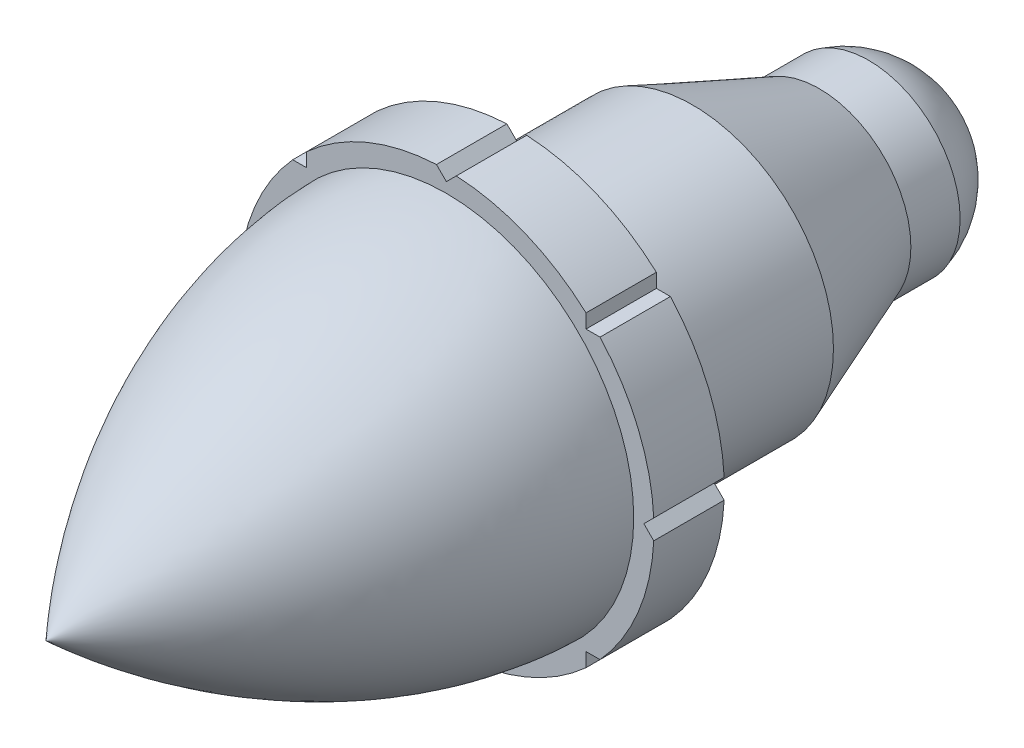
ISO-10303-21;
HEADER;
FILE_DESCRIPTION(('STEP AP214'),'2;1');
FILE_NAME('part.step','',(''),(''),'','','');
FILE_SCHEMA(('AUTOMOTIVE_DESIGN { 1 0 10303 214 1 1 1 1 }'));
ENDSEC;
DATA;
#1=APPLICATION_CONTEXT('core data for automotive mechanical design processes');
#2=APPLICATION_PROTOCOL_DEFINITION('international standard','automotive_design',2000,#1);
#3=PRODUCT_CONTEXT('',#1,'mechanical');
#4=PRODUCT('Part','Part','',(#3));
#5=PRODUCT_RELATED_PRODUCT_CATEGORY('part','',(#4));
#6=PRODUCT_DEFINITION_FORMATION('','',#4);
#7=PRODUCT_DEFINITION_CONTEXT('part definition',#1,'design');
#8=PRODUCT_DEFINITION('design','',#6,#7);
#9=PRODUCT_DEFINITION_SHAPE('','',#8);
#10=(LENGTH_UNIT() NAMED_UNIT(*) SI_UNIT(.MILLI.,.METRE.));
#11=(NAMED_UNIT(*) PLANE_ANGLE_UNIT() SI_UNIT($,.RADIAN.));
#12=(NAMED_UNIT(*) SI_UNIT($,.STERADIAN.) SOLID_ANGLE_UNIT());
#13=UNCERTAINTY_MEASURE_WITH_UNIT(LENGTH_MEASURE(1.E-05),#10,'distance_accuracy_value','');
#14=(GEOMETRIC_REPRESENTATION_CONTEXT(3) GLOBAL_UNCERTAINTY_ASSIGNED_CONTEXT((#13)) GLOBAL_UNIT_ASSIGNED_CONTEXT((#10,
#11,#12)) REPRESENTATION_CONTEXT('',''));
#15=CARTESIAN_POINT('',(0.,0.,0.));
#16=DIRECTION('',(0.,0.,1.));
#17=DIRECTION('',(1.,0.,0.));
#18=AXIS2_PLACEMENT_3D('',#15,#16,#17);
#19=CARTESIAN_POINT('',(0.,0.,20.0206031837859));
#20=DIRECTION('',(0.,0.,1.));
#21=DIRECTION('',(1.,0.,0.));
#22=AXIS2_PLACEMENT_3D('',#19,#20,#21);
#23=CYLINDRICAL_SURFACE('',#22,7.493);
#24=CARTESIAN_POINT('',(0.,0.,7.32584661558963));
#25=DIRECTION('',(0.,0.,1.));
#26=DIRECTION('',(1.,0.,0.));
#27=AXIS2_PLACEMENT_3D('',#24,#25,#26);
#28=CIRCLE('',#27,7.493);
#29=CARTESIAN_POINT('',(-7.48448393377129,-0.357140371730017,7.32584661558963));
#30=VERTEX_POINT('',#29);
#31=CARTESIAN_POINT('',(-5.54486572193718,-5.03979296456571,7.32584661558963));
#32=VERTEX_POINT('',#31);
#33=EDGE_CURVE('E405',#30,#32,#28,.T.);
#34=ORIENTED_EDGE('',*,*,#33,.F.);
#35=DIRECTION('',(0.,0.,1.));
#36=VECTOR('',#35,1.);
#37=CARTESIAN_POINT('',(-7.48448393377129,-0.357140371730017,-10.4541533844104));
#38=LINE('',#37,#36);
#39=CARTESIAN_POINT('',(-7.48448393377129,-0.357140371730017,4.78584661558963));
#40=VERTEX_POINT('',#39);
#41=EDGE_CURVE('E259',#40,#30,#38,.T.);
#42=ORIENTED_EDGE('',*,*,#41,.F.);
#43=CARTESIAN_POINT('',(0.,0.,4.78584661558963));
#44=DIRECTION('',(0.,0.,1.));
#45=DIRECTION('',(1.,0.,0.));
#46=AXIS2_PLACEMENT_3D('',#43,#44,#45);
#47=CIRCLE('',#46,7.493);
#48=CARTESIAN_POINT('',(-5.54486572193718,-5.03979296456571,4.78584661558963));
#49=VERTEX_POINT('',#48);
#50=EDGE_CURVE('E452',#40,#49,#47,.T.);
#51=ORIENTED_EDGE('',*,*,#50,.T.);
#52=DIRECTION('',(0.,0.,1.));
#53=VECTOR('',#52,1.);
#54=CARTESIAN_POINT('',(-5.54486572193718,-5.03979296456571,-10.4541533844104));
#55=LINE('',#54,#53);
#56=EDGE_CURVE('E273',#49,#32,#55,.T.);
#57=ORIENTED_EDGE('',*,*,#56,.T.);
#58=EDGE_LOOP('',(#34,#42,#51,#57));
#59=FACE_BOUND('',#58,.T.);
#60=ADVANCED_FACE('F38',(#59),#23,.T.);
#61=CARTESIAN_POINT('',(-5.03979296456566,-5.54486572193723,7.32584661558963));
#62=VERTEX_POINT('',#61);
#63=CARTESIAN_POINT('',(-0.35714037172999,-7.48448393377129,7.32584661558963));
#64=VERTEX_POINT('',#63);
#65=EDGE_CURVE('E411',#62,#64,#28,.T.);
#66=ORIENTED_EDGE('',*,*,#65,.F.);
#67=DIRECTION('',(0.,0.,1.));
#68=VECTOR('',#67,1.);
#69=CARTESIAN_POINT('',(-5.03979296456566,-5.54486572193723,-10.4541533844104));
#70=LINE('',#69,#68);
#71=CARTESIAN_POINT('',(-5.03979296456566,-5.54486572193723,4.78584661558963));
#72=VERTEX_POINT('',#71);
#73=EDGE_CURVE('E279',#72,#62,#70,.T.);
#74=ORIENTED_EDGE('',*,*,#73,.F.);
#75=CARTESIAN_POINT('',(-0.357140371729993,-7.48448393377129,4.78584661558963));
#76=VERTEX_POINT('',#75);
#77=EDGE_CURVE('E455',#72,#76,#47,.T.);
#78=ORIENTED_EDGE('',*,*,#77,.T.);
#79=DIRECTION('',(0.,0.,1.));
#80=VECTOR('',#79,1.);
#81=CARTESIAN_POINT('',(-0.35714037172999,-7.48448393377129,-10.4541533844104));
#82=LINE('',#81,#80);
#83=EDGE_CURVE('E291',#76,#64,#82,.T.);
#84=ORIENTED_EDGE('',*,*,#83,.T.);
#85=EDGE_LOOP('',(#66,#74,#78,#84));
#86=FACE_BOUND('',#85,.T.);
#87=ADVANCED_FACE('F395',(#86),#23,.T.);
#88=CARTESIAN_POINT('',(0.357140371729991,-7.48448393377129,7.32584661558963));
#89=VERTEX_POINT('',#88);
#90=CARTESIAN_POINT('',(5.03979296456573,-5.54486572193716,7.32584661558963));
#91=VERTEX_POINT('',#90);
#92=EDGE_CURVE('E416',#89,#91,#28,.T.);
#93=ORIENTED_EDGE('',*,*,#92,.F.);
#94=DIRECTION('',(0.,0.,1.));
#95=VECTOR('',#94,1.);
#96=CARTESIAN_POINT('',(0.357140371729991,-7.48448393377129,-10.4541533844104));
#97=LINE('',#96,#95);
#98=CARTESIAN_POINT('',(0.357140371729991,-7.48448393377129,4.78584661558963));
#99=VERTEX_POINT('',#98);
#100=EDGE_CURVE('E297',#99,#89,#97,.T.);
#101=ORIENTED_EDGE('',*,*,#100,.F.);
#102=CARTESIAN_POINT('',(5.03979296456573,-5.54486572193716,4.78584661558963));
#103=VERTEX_POINT('',#102);
#104=EDGE_CURVE('E457',#99,#103,#47,.T.);
#105=ORIENTED_EDGE('',*,*,#104,.T.);
#106=DIRECTION('',(0.,0.,1.));
#107=VECTOR('',#106,1.);
#108=CARTESIAN_POINT('',(5.03979296456573,-5.54486572193716,-10.4541533844104));
#109=LINE('',#108,#107);
#110=EDGE_CURVE('E307',#103,#91,#109,.T.);
#111=ORIENTED_EDGE('',*,*,#110,.T.);
#112=EDGE_LOOP('',(#93,#101,#105,#111));
#113=FACE_BOUND('',#112,.T.);
#114=ADVANCED_FACE('F400',(#113),#23,.T.);
#115=CARTESIAN_POINT('',(5.54486572193725,-5.03979296456564,7.32584661558963));
#116=VERTEX_POINT('',#115);
#117=CARTESIAN_POINT('',(7.48448393377129,-0.357140371729912,7.32584661558963));
#118=VERTEX_POINT('',#117);
#119=EDGE_CURVE('E225',#116,#118,#28,.T.);
#120=ORIENTED_EDGE('',*,*,#119,.F.);
#121=DIRECTION('',(0.,0.,1.));
#122=VECTOR('',#121,1.);
#123=CARTESIAN_POINT('',(5.54486572193725,-5.03979296456564,-10.4541533844104));
#124=LINE('',#123,#122);
#125=CARTESIAN_POINT('',(5.54486572193725,-5.03979296456564,4.78584661558963));
#126=VERTEX_POINT('',#125);
#127=EDGE_CURVE('E313',#126,#116,#124,.T.);
#128=ORIENTED_EDGE('',*,*,#127,.F.);
#129=CARTESIAN_POINT('',(7.48448393377129,-0.357140371729912,4.78584661558963));
#130=VERTEX_POINT('',#129);
#131=EDGE_CURVE('E446',#126,#130,#47,.T.);
#132=ORIENTED_EDGE('',*,*,#131,.T.);
#133=DIRECTION('',(0.,0.,1.));
#134=VECTOR('',#133,1.);
#135=CARTESIAN_POINT('',(7.48448393377129,-0.357140371729912,-10.4541533844104));
#136=LINE('',#135,#134);
#137=EDGE_CURVE('E61',#130,#118,#136,.T.);
#138=ORIENTED_EDGE('',*,*,#137,.T.);
#139=EDGE_LOOP('',(#120,#128,#132,#138));
#140=FACE_BOUND('',#139,.T.);
#141=ADVANCED_FACE('F468',(#140),#23,.T.);
#142=CARTESIAN_POINT('',(7.48448393377129,0.357140371730069,7.32584661558963));
#143=VERTEX_POINT('',#142);
#144=CARTESIAN_POINT('',(5.54486572193715,5.03979296456575,7.32584661558963));
#145=VERTEX_POINT('',#144);
#146=EDGE_CURVE('E450',#143,#145,#28,.T.);
#147=ORIENTED_EDGE('',*,*,#146,.F.);
#148=DIRECTION('',(0.,0.,1.));
#149=VECTOR('',#148,1.);
#150=CARTESIAN_POINT('',(7.48448393377129,0.357140371730069,-10.4541533844104));
#151=LINE('',#150,#149);
#152=CARTESIAN_POINT('',(7.48448393377129,0.357140371730069,4.78584661558963));
#153=VERTEX_POINT('',#152);
#154=EDGE_CURVE('E214',#153,#143,#151,.T.);
#155=ORIENTED_EDGE('',*,*,#154,.F.);
#156=CARTESIAN_POINT('',(5.54486572193715,5.03979296456575,4.78584661558963));
#157=VERTEX_POINT('',#156);
#158=EDGE_CURVE('E444',#153,#157,#47,.T.);
#159=ORIENTED_EDGE('',*,*,#158,.T.);
#160=DIRECTION('',(0.,0.,1.));
#161=VECTOR('',#160,1.);
#162=CARTESIAN_POINT('',(5.54486572193715,5.03979296456575,-10.4541533844104));
#163=LINE('',#162,#161);
#164=EDGE_CURVE('E53',#157,#145,#163,.T.);
#165=ORIENTED_EDGE('',*,*,#164,.T.);
#166=EDGE_LOOP('',(#147,#155,#159,#165));
#167=FACE_BOUND('',#166,.T.);
#168=ADVANCED_FACE('F471',(#167),#23,.T.);
#169=CARTESIAN_POINT('',(5.03979296456562,5.54486572193727,7.32584661558963));
#170=VERTEX_POINT('',#169);
#171=CARTESIAN_POINT('',(0.35714037172999,7.48448393377129,7.32584661558963));
#172=VERTEX_POINT('',#171);
#173=EDGE_CURVE('E420',#170,#172,#28,.T.);
#174=ORIENTED_EDGE('',*,*,#173,.F.);
#175=DIRECTION('',(0.,0.,1.));
#176=VECTOR('',#175,1.);
#177=CARTESIAN_POINT('',(5.03979296456562,5.54486572193727,-10.4541533844104));
#178=LINE('',#177,#176);
#179=CARTESIAN_POINT('',(5.03979296456562,5.54486572193727,4.78584661558963));
#180=VERTEX_POINT('',#179);
#181=EDGE_CURVE('E244',#180,#170,#178,.T.);
#182=ORIENTED_EDGE('',*,*,#181,.F.);
#183=CARTESIAN_POINT('',(0.357140371729989,7.48448393377129,4.78584661558963));
#184=VERTEX_POINT('',#183);
#185=EDGE_CURVE('E428',#180,#184,#47,.T.);
#186=ORIENTED_EDGE('',*,*,#185,.T.);
#187=DIRECTION('',(0.,0.,1.));
#188=VECTOR('',#187,1.);
#189=CARTESIAN_POINT('',(0.35714037172999,7.48448393377129,-10.4541533844104));
#190=LINE('',#189,#188);
#191=EDGE_CURVE('E347',#184,#172,#190,.T.);
#192=ORIENTED_EDGE('',*,*,#191,.T.);
#193=EDGE_LOOP('',(#174,#182,#186,#192));
#194=FACE_BOUND('',#193,.T.);
#195=ADVANCED_FACE('F391',(#194),#23,.T.);
#196=CARTESIAN_POINT('',(-5.54486572193722,5.03979296456567,4.78584661558963));
#197=VERTEX_POINT('',#196);
#198=CARTESIAN_POINT('',(-7.48448393377129,0.357140371729963,4.78584661558963));
#199=VERTEX_POINT('',#198);
#200=EDGE_CURVE('E449',#197,#199,#47,.T.);
#201=ORIENTED_EDGE('',*,*,#200,.T.);
#202=DIRECTION('',(0.,0.,1.));
#203=VECTOR('',#202,1.);
#204=CARTESIAN_POINT('',(-7.48448393377129,0.357140371729964,-10.4541533844104));
#205=LINE('',#204,#203);
#206=CARTESIAN_POINT('',(-7.48448393377129,0.357140371729964,7.32584661558963));
#207=VERTEX_POINT('',#206);
#208=EDGE_CURVE('E253',#199,#207,#205,.T.);
#209=ORIENTED_EDGE('',*,*,#208,.T.);
#210=CARTESIAN_POINT('',(-5.54486572193722,5.03979296456567,7.32584661558963));
#211=VERTEX_POINT('',#210);
#212=EDGE_CURVE('E410',#211,#207,#28,.T.);
#213=ORIENTED_EDGE('',*,*,#212,.F.);
#214=DIRECTION('',(0.,0.,1.));
#215=VECTOR('',#214,1.);
#216=CARTESIAN_POINT('',(-5.54486572193722,5.03979296456567,-10.4541533844104));
#217=LINE('',#216,#215);
#218=EDGE_CURVE('E329',#197,#211,#217,.T.);
#219=ORIENTED_EDGE('',*,*,#218,.F.);
#220=EDGE_LOOP('',(#201,#209,#213,#219));
#221=FACE_BOUND('',#220,.T.);
#222=ADVANCED_FACE('F385',(#221),#23,.T.);
#223=CARTESIAN_POINT('',(0.,0.,7.32584661558963));
#224=DIRECTION('',(0.,0.,-1.));
#225=DIRECTION('',(-1.,0.,0.));
#226=AXIS2_PLACEMENT_3D('',#223,#224,#225);
#227=PLANE('',#226);
#228=CARTESIAN_POINT('',(0.,0.,7.32584661558963));
#229=DIRECTION('',(0.,0.,1.));
#230=DIRECTION('',(1.,0.,0.));
#231=AXIS2_PLACEMENT_3D('',#228,#229,#230);
#232=CIRCLE('',#231,6.7616871240826);
#233=CARTESIAN_POINT('',(6.7616871240826,0.,7.32584661558963));
#234=VERTEX_POINT('',#233);
#235=EDGE_CURVE('E419',#234,#234,#232,.T.);
#236=ORIENTED_EDGE('',*,*,#235,.F.);
#237=EDGE_LOOP('',(#236));
#238=FACE_BOUND('',#237,.T.);
#239=DIRECTION('',(-0.707106781186552,0.707106781186543,0.));
#240=VECTOR('',#239,1.);
#241=CARTESIAN_POINT('',(-7.1273435620413,0.,7.32584661558963));
#242=LINE('',#241,#240);
#243=CARTESIAN_POINT('',(-7.1273435620413,0.,7.32584661558963));
#244=VERTEX_POINT('',#243);
#245=EDGE_CURVE('E248',#244,#207,#242,.T.);
#246=ORIENTED_EDGE('',*,*,#245,.F.);
#247=DIRECTION('',(0.707106781186547,0.707106781186548,0.));
#248=VECTOR('',#247,1.);
#249=CARTESIAN_POINT('',(-7.1273435620413,0.,7.32584661558963));
#250=LINE('',#249,#248);
#251=EDGE_CURVE('E261',#30,#244,#250,.T.);
#252=ORIENTED_EDGE('',*,*,#251,.F.);
#253=ORIENTED_EDGE('',*,*,#33,.T.);
#254=DIRECTION('',(-1.,0.,0.));
#255=VECTOR('',#254,1.);
#256=CARTESIAN_POINT('',(-5.03979296456566,-5.03979296456571,7.32584661558963));
#257=LINE('',#256,#255);
#258=CARTESIAN_POINT('',(-5.03979296456566,-5.03979296456571,7.32584661558963));
#259=VERTEX_POINT('',#258);
#260=EDGE_CURVE('E268',#259,#32,#257,.T.);
#261=ORIENTED_EDGE('',*,*,#260,.F.);
#262=DIRECTION('',(0.,1.,0.));
#263=VECTOR('',#262,1.);
#264=CARTESIAN_POINT('',(-5.03979296456566,-5.03979296456571,7.32584661558963));
#265=LINE('',#264,#263);
#266=EDGE_CURVE('E281',#62,#259,#265,.T.);
#267=ORIENTED_EDGE('',*,*,#266,.F.);
#268=ORIENTED_EDGE('',*,*,#65,.T.);
#269=DIRECTION('',(-0.707106781186546,-0.707106781186549,0.));
#270=VECTOR('',#269,1.);
#271=CARTESIAN_POINT('',(0.,-7.1273435620413,7.32584661558963));
#272=LINE('',#271,#270);
#273=CARTESIAN_POINT('',(0.,-7.1273435620413,7.32584661558963));
#274=VERTEX_POINT('',#273);
#275=EDGE_CURVE('E286',#274,#64,#272,.T.);
#276=ORIENTED_EDGE('',*,*,#275,.F.);
#277=DIRECTION('',(-0.707106781186546,0.707106781186549,0.));
#278=VECTOR('',#277,1.);
#279=CARTESIAN_POINT('',(0.,-7.1273435620413,7.32584661558963));
#280=LINE('',#279,#278);
#281=EDGE_CURVE('E299',#89,#274,#280,.T.);
#282=ORIENTED_EDGE('',*,*,#281,.F.);
#283=ORIENTED_EDGE('',*,*,#92,.T.);
#284=DIRECTION('',(0.,-1.,0.));
#285=VECTOR('',#284,1.);
#286=CARTESIAN_POINT('',(5.03979296456573,-5.03979296456564,7.32584661558963));
#287=LINE('',#286,#285);
#288=CARTESIAN_POINT('',(5.03979296456573,-5.03979296456564,7.32584661558963));
#289=VERTEX_POINT('',#288);
#290=EDGE_CURVE('E236',#289,#91,#287,.T.);
#291=ORIENTED_EDGE('',*,*,#290,.F.);
#292=DIRECTION('',(-1.,0.,0.));
#293=VECTOR('',#292,1.);
#294=CARTESIAN_POINT('',(5.03979296456573,-5.03979296456564,7.32584661558963));
#295=LINE('',#294,#293);
#296=EDGE_CURVE('E315',#116,#289,#295,.T.);
#297=ORIENTED_EDGE('',*,*,#296,.F.);
#298=ORIENTED_EDGE('',*,*,#119,.T.);
#299=DIRECTION('',(0.707106781186557,-0.707106781186538,0.));
#300=VECTOR('',#299,1.);
#301=CARTESIAN_POINT('',(7.1273435620413,0.,7.32584661558963));
#302=LINE('',#301,#300);
#303=CARTESIAN_POINT('',(7.1273435620413,0.,7.32584661558963));
#304=VERTEX_POINT('',#303);
#305=EDGE_CURVE('E205',#304,#118,#302,.T.);
#306=ORIENTED_EDGE('',*,*,#305,.F.);
#307=DIRECTION('',(-0.707106781186542,-0.707106781186553,0.));
#308=VECTOR('',#307,1.);
#309=CARTESIAN_POINT('',(7.1273435620413,0.,7.32584661558963));
#310=LINE('',#309,#308);
#311=EDGE_CURVE('E211',#143,#304,#310,.T.);
#312=ORIENTED_EDGE('',*,*,#311,.F.);
#313=ORIENTED_EDGE('',*,*,#146,.T.);
#314=DIRECTION('',(1.,0.,0.));
#315=VECTOR('',#314,1.);
#316=CARTESIAN_POINT('',(5.03979296456562,5.03979296456575,7.32584661558963));
#317=LINE('',#316,#315);
#318=CARTESIAN_POINT('',(5.03979296456562,5.03979296456575,7.32584661558963));
#319=VERTEX_POINT('',#318);
#320=EDGE_CURVE('E237',#319,#145,#317,.T.);
#321=ORIENTED_EDGE('',*,*,#320,.F.);
#322=DIRECTION('',(0.,-1.,0.));
#323=VECTOR('',#322,1.);
#324=CARTESIAN_POINT('',(5.03979296456562,5.03979296456575,7.32584661558963));
#325=LINE('',#324,#323);
#326=EDGE_CURVE('E229',#170,#319,#325,.T.);
#327=ORIENTED_EDGE('',*,*,#326,.F.);
#328=ORIENTED_EDGE('',*,*,#173,.T.);
#329=DIRECTION('',(0.707106781186546,0.707106781186549,0.));
#330=VECTOR('',#329,1.);
#331=CARTESIAN_POINT('',(0.,7.1273435620413,7.32584661558963));
#332=LINE('',#331,#330);
#333=CARTESIAN_POINT('',(0.,7.1273435620413,7.32584661558963));
#334=VERTEX_POINT('',#333);
#335=EDGE_CURVE('E340',#334,#172,#332,.T.);
#336=ORIENTED_EDGE('',*,*,#335,.F.);
#337=DIRECTION('',(0.707106781186546,-0.707106781186549,0.));
#338=VECTOR('',#337,1.);
#339=CARTESIAN_POINT('',(0.,7.1273435620413,7.32584661558963));
#340=LINE('',#339,#338);
#341=CARTESIAN_POINT('',(-0.357140371729991,7.48448393377129,7.32584661558963));
#342=VERTEX_POINT('',#341);
#343=EDGE_CURVE('E337',#342,#334,#340,.T.);
#344=ORIENTED_EDGE('',*,*,#343,.F.);
#345=CARTESIAN_POINT('',(-5.0397929645657,5.5448657219372,7.32584661558963));
#346=VERTEX_POINT('',#345);
#347=EDGE_CURVE('E414',#342,#346,#28,.T.);
#348=ORIENTED_EDGE('',*,*,#347,.T.);
#349=DIRECTION('',(0.,1.,0.));
#350=VECTOR('',#349,1.);
#351=CARTESIAN_POINT('',(-5.03979296456569,5.03979296456568,7.32584661558963));
#352=LINE('',#351,#350);
#353=CARTESIAN_POINT('',(-5.03979296456569,5.03979296456568,7.32584661558963));
#354=VERTEX_POINT('',#353);
#355=EDGE_CURVE('E267',#354,#346,#352,.T.);
#356=ORIENTED_EDGE('',*,*,#355,.F.);
#357=DIRECTION('',(1.,0.,0.));
#358=VECTOR('',#357,1.);
#359=CARTESIAN_POINT('',(-5.03979296456569,5.03979296456568,7.32584661558963));
#360=LINE('',#359,#358);
#361=EDGE_CURVE('E331',#211,#354,#360,.T.);
#362=ORIENTED_EDGE('',*,*,#361,.F.);
#363=ORIENTED_EDGE('',*,*,#212,.T.);
#364=EDGE_LOOP('',(#246,#252,#253,#261,#267,#268,#276,#282,#283,#291,#297,#298,#306,#312,#313,
#321,#327,#328,#336,#344,#348,#356,#362,#363));
#365=FACE_BOUND('',#364,.T.);
#366=ADVANCED_FACE('F222',(#238,#365),#227,.F.);
#367=CARTESIAN_POINT('',(-0.357140371729991,7.48448393377129,4.78584661558963));
#368=VERTEX_POINT('',#367);
#369=CARTESIAN_POINT('',(-5.0397929645657,5.5448657219372,4.78584661558963));
#370=VERTEX_POINT('',#369);
#371=EDGE_CURVE('E421',#368,#370,#47,.T.);
#372=ORIENTED_EDGE('',*,*,#371,.T.);
#373=DIRECTION('',(0.,0.,1.));
#374=VECTOR('',#373,1.);
#375=CARTESIAN_POINT('',(-5.0397929645657,5.5448657219372,-10.4541533844104));
#376=LINE('',#375,#374);
#377=EDGE_CURVE('E323',#370,#346,#376,.T.);
#378=ORIENTED_EDGE('',*,*,#377,.T.);
#379=ORIENTED_EDGE('',*,*,#347,.F.);
#380=DIRECTION('',(0.,0.,1.));
#381=VECTOR('',#380,1.);
#382=CARTESIAN_POINT('',(-0.357140371729991,7.48448393377129,-10.4541533844104));
#383=LINE('',#382,#381);
#384=EDGE_CURVE('E344',#368,#342,#383,.T.);
#385=ORIENTED_EDGE('',*,*,#384,.F.);
#386=EDGE_LOOP('',(#372,#378,#379,#385));
#387=FACE_BOUND('',#386,.T.);
#388=ADVANCED_FACE('F381',(#387),#23,.T.);
#389=CARTESIAN_POINT('',(0.,7.493,4.78584661558963));
#390=DIRECTION('',(0.,0.,1.));
#391=DIRECTION('',(1.,0.,0.));
#392=AXIS2_PLACEMENT_3D('',#389,#390,#391);
#393=PLANE('',#392);
#394=ORIENTED_EDGE('',*,*,#50,.F.);
#395=DIRECTION('',(0.707106781186547,0.707106781186548,0.));
#396=VECTOR('',#395,1.);
#397=CARTESIAN_POINT('',(-7.31017178102065,-0.182828218979377,4.78584661558963));
#398=LINE('',#397,#396);
#399=CARTESIAN_POINT('',(-7.1273435620413,0.,4.78584661558963));
#400=VERTEX_POINT('',#399);
#401=EDGE_CURVE('E264',#40,#400,#398,.T.);
#402=ORIENTED_EDGE('',*,*,#401,.T.);
#403=DIRECTION('',(-0.707106781186552,0.707106781186543,0.));
#404=VECTOR('',#403,1.);
#405=CARTESIAN_POINT('',(-7.31017178102065,0.182828218979325,4.78584661558963));
#406=LINE('',#405,#404);
#407=EDGE_CURVE('E256',#400,#199,#406,.T.);
#408=ORIENTED_EDGE('',*,*,#407,.T.);
#409=ORIENTED_EDGE('',*,*,#200,.F.);
#410=DIRECTION('',(1.,0.,0.));
#411=VECTOR('',#410,1.);
#412=CARTESIAN_POINT('',(-5.29835111143081,5.03979296456568,4.78584661558963));
#413=LINE('',#412,#411);
#414=CARTESIAN_POINT('',(-5.03979296456569,5.03979296456568,4.78584661558963));
#415=VERTEX_POINT('',#414);
#416=EDGE_CURVE('E334',#197,#415,#413,.T.);
#417=ORIENTED_EDGE('',*,*,#416,.T.);
#418=DIRECTION('',(0.,1.,0.));
#419=VECTOR('',#418,1.);
#420=CARTESIAN_POINT('',(-5.03979296456569,5.29835111143079,4.78584661558963));
#421=LINE('',#420,#419);
#422=EDGE_CURVE('E326',#415,#370,#421,.T.);
#423=ORIENTED_EDGE('',*,*,#422,.T.);
#424=ORIENTED_EDGE('',*,*,#371,.F.);
#425=DIRECTION('',(0.707106781186546,-0.707106781186549,0.));
#426=VECTOR('',#425,1.);
#427=CARTESIAN_POINT('',(-0.182828218979351,7.31017178102065,4.78584661558963));
#428=LINE('',#427,#426);
#429=CARTESIAN_POINT('',(0.,7.1273435620413,4.78584661558963));
#430=VERTEX_POINT('',#429);
#431=EDGE_CURVE('E11',#368,#430,#428,.T.);
#432=ORIENTED_EDGE('',*,*,#431,.T.);
#433=DIRECTION('',(0.707106781186546,0.707106781186549,0.));
#434=VECTOR('',#433,1.);
#435=CARTESIAN_POINT('',(0.182828218979351,7.31017178102065,4.78584661558963));
#436=LINE('',#435,#434);
#437=EDGE_CURVE('E46',#430,#184,#436,.T.);
#438=ORIENTED_EDGE('',*,*,#437,.T.);
#439=ORIENTED_EDGE('',*,*,#185,.F.);
#440=DIRECTION('',(0.,-1.,0.));
#441=VECTOR('',#440,1.);
#442=CARTESIAN_POINT('',(5.03979296456562,5.29835111143086,4.78584661558963));
#443=LINE('',#442,#441);
#444=CARTESIAN_POINT('',(5.03979296456562,5.03979296456575,4.78584661558963));
#445=VERTEX_POINT('',#444);
#446=EDGE_CURVE('E226',#180,#445,#443,.T.);
#447=ORIENTED_EDGE('',*,*,#446,.T.);
#448=DIRECTION('',(1.,0.,0.));
#449=VECTOR('',#448,1.);
#450=CARTESIAN_POINT('',(5.29835111143074,5.03979296456575,4.78584661558963));
#451=LINE('',#450,#449);
#452=EDGE_CURVE('E242',#445,#157,#451,.T.);
#453=ORIENTED_EDGE('',*,*,#452,.T.);
#454=ORIENTED_EDGE('',*,*,#158,.F.);
#455=DIRECTION('',(-0.707106781186542,-0.707106781186553,0.));
#456=VECTOR('',#455,1.);
#457=CARTESIAN_POINT('',(7.31017178102065,0.182828218979428,4.78584661558963));
#458=LINE('',#457,#456);
#459=CARTESIAN_POINT('',(7.1273435620413,0.,4.78584661558963));
#460=VERTEX_POINT('',#459);
#461=EDGE_CURVE('E218',#153,#460,#458,.T.);
#462=ORIENTED_EDGE('',*,*,#461,.T.);
#463=DIRECTION('',(0.707106781186557,-0.707106781186538,0.));
#464=VECTOR('',#463,1.);
#465=CARTESIAN_POINT('',(7.31017178102065,-0.182828218979274,4.78584661558963));
#466=LINE('',#465,#464);
#467=EDGE_CURVE('E206',#460,#130,#466,.T.);
#468=ORIENTED_EDGE('',*,*,#467,.T.);
#469=ORIENTED_EDGE('',*,*,#131,.F.);
#470=DIRECTION('',(-1.,0.,0.));
#471=VECTOR('',#470,1.);
#472=CARTESIAN_POINT('',(5.29835111143085,-5.03979296456564,4.78584661558963));
#473=LINE('',#472,#471);
#474=CARTESIAN_POINT('',(5.03979296456573,-5.03979296456564,4.78584661558963));
#475=VERTEX_POINT('',#474);
#476=EDGE_CURVE('E289',#126,#475,#473,.T.);
#477=ORIENTED_EDGE('',*,*,#476,.T.);
#478=DIRECTION('',(0.,-1.,0.));
#479=VECTOR('',#478,1.);
#480=CARTESIAN_POINT('',(5.03979296456573,-5.29835111143076,4.78584661558963));
#481=LINE('',#480,#479);
#482=EDGE_CURVE('E310',#475,#103,#481,.T.);
#483=ORIENTED_EDGE('',*,*,#482,.T.);
#484=ORIENTED_EDGE('',*,*,#104,.F.);
#485=DIRECTION('',(-0.707106781186546,0.707106781186549,0.));
#486=VECTOR('',#485,1.);
#487=CARTESIAN_POINT('',(0.182828218979351,-7.31017178102065,4.78584661558963));
#488=LINE('',#487,#486);
#489=CARTESIAN_POINT('',(0.,-7.1273435620413,4.78584661558963));
#490=VERTEX_POINT('',#489);
#491=EDGE_CURVE('E271',#99,#490,#488,.T.);
#492=ORIENTED_EDGE('',*,*,#491,.T.);
#493=DIRECTION('',(-0.707106781186546,-0.707106781186549,0.));
#494=VECTOR('',#493,1.);
#495=CARTESIAN_POINT('',(-0.182828218979351,-7.31017178102065,4.78584661558963));
#496=LINE('',#495,#494);
#497=EDGE_CURVE('E294',#490,#76,#496,.T.);
#498=ORIENTED_EDGE('',*,*,#497,.T.);
#499=ORIENTED_EDGE('',*,*,#77,.F.);
#500=DIRECTION('',(0.,1.,0.));
#501=VECTOR('',#500,1.);
#502=CARTESIAN_POINT('',(-5.03979296456566,-5.29835111143083,4.78584661558963));
#503=LINE('',#502,#501);
#504=CARTESIAN_POINT('',(-5.03979296456566,-5.03979296456571,4.78584661558963));
#505=VERTEX_POINT('',#504);
#506=EDGE_CURVE('E251',#72,#505,#503,.T.);
#507=ORIENTED_EDGE('',*,*,#506,.T.);
#508=DIRECTION('',(-1.,0.,0.));
#509=VECTOR('',#508,1.);
#510=CARTESIAN_POINT('',(-5.29835111143078,-5.03979296456571,4.78584661558963));
#511=LINE('',#510,#509);
#512=EDGE_CURVE('E276',#505,#49,#511,.T.);
#513=ORIENTED_EDGE('',*,*,#512,.T.);
#514=EDGE_LOOP('',(#394,#402,#408,#409,#417,#423,#424,#432,#438,#439,#447,#453,#454,#462,#468,
#469,#477,#483,#484,#492,#498,#499,#507,#513));
#515=FACE_BOUND('',#514,.T.);
#516=CARTESIAN_POINT('',(0.,0.,4.78584661558963));
#517=DIRECTION('',(0.,0.,1.));
#518=DIRECTION('',(1.,0.,0.));
#519=AXIS2_PLACEMENT_3D('',#516,#517,#518);
#520=CIRCLE('',#519,5.08);
#521=CARTESIAN_POINT('',(5.08,0.,4.78584661558963));
#522=VERTEX_POINT('',#521);
#523=EDGE_CURVE('E357',#522,#522,#520,.T.);
#524=ORIENTED_EDGE('',*,*,#523,.T.);
#525=EDGE_LOOP('',(#524));
#526=FACE_BOUND('',#525,.T.);
#527=ADVANCED_FACE('F377',(#515,#526),#393,.F.);
#528=CARTESIAN_POINT('',(0.,0.,20.0206031837859));
#529=DIRECTION('',(0.,0.,1.));
#530=DIRECTION('',(1.,0.,0.));
#531=AXIS2_PLACEMENT_3D('',#528,#529,#530);
#532=CYLINDRICAL_SURFACE('',#531,5.08);
#533=CARTESIAN_POINT('',(0.,0.,-1.56415338441037));
#534=DIRECTION('',(0.,0.,1.));
#535=DIRECTION('',(1.,0.,0.));
#536=AXIS2_PLACEMENT_3D('',#533,#534,#535);
#537=CIRCLE('',#536,5.08);
#538=CARTESIAN_POINT('',(5.08,0.,-1.56415338441037));
#539=VERTEX_POINT('',#538);
#540=EDGE_CURVE('E351',#539,#539,#537,.T.);
#541=ORIENTED_EDGE('',*,*,#540,.T.);
#542=EDGE_LOOP('',(#541));
#543=FACE_BOUND('',#542,.T.);
#544=ORIENTED_EDGE('',*,*,#523,.F.);
#545=EDGE_LOOP('',(#544));
#546=FACE_BOUND('',#545,.T.);
#547=ADVANCED_FACE('F372',(#543,#546),#532,.T.);
#548=CARTESIAN_POINT('',(0.,6.7616871240826,7.32584661558963));
#549=CARTESIAN_POINT('',(0.,6.61247248174379,12.742491310167));
#550=CARTESIAN_POINT('',(0.,3.55850613692033,17.8897023235605));
#551=CARTESIAN_POINT('',(0.,0.,21.7754643832873));
#552=B_SPLINE_CURVE_WITH_KNOTS('',3,(#548,#549,#550,#551),.UNSPECIFIED.,.F.,.F.,(4,4),(0.,1.),.UNSPECIFIED.);
#553=CARTESIAN_POINT('',(0.,0.,22.8074579612695));
#554=DIRECTION('',(0.,0.,1.));
#555=AXIS1_PLACEMENT('',#553,#554);
#556=SURFACE_OF_REVOLUTION('',#552,#555);
#557=CARTESIAN_POINT('',(0.,0.,21.7754643832873));
#558=VERTEX_POINT('',#557);
#559=VERTEX_LOOP('',#558);
#560=FACE_BOUND('',#559,.T.);
#561=ORIENTED_EDGE('',*,*,#235,.T.);
#562=EDGE_LOOP('',(#561));
#563=FACE_BOUND('',#562,.T.);
#564=ADVANCED_FACE('F367',(#560,#563),#556,.T.);
#565=CARTESIAN_POINT('',(0.,0.,24.6846988762189));
#566=DIRECTION('',(0.,0.,1.));
#567=DIRECTION('',(1.,0.,0.));
#568=AXIS2_PLACEMENT_3D('',#565,#566,#567);
#569=CYLINDRICAL_SURFACE('',#568,3.302);
#570=CARTESIAN_POINT('',(0.,0.,-7.91415338441037));
#571=DIRECTION('',(0.,0.,1.));
#572=DIRECTION('',(1.,0.,0.));
#573=AXIS2_PLACEMENT_3D('',#570,#571,#572);
#574=CIRCLE('',#573,3.302);
#575=CARTESIAN_POINT('',(3.302,0.,-7.91415338441037));
#576=VERTEX_POINT('',#575);
#577=EDGE_CURVE('E346',#576,#576,#574,.T.);
#578=ORIENTED_EDGE('',*,*,#577,.T.);
#579=EDGE_LOOP('',(#578));
#580=FACE_BOUND('',#579,.T.);
#581=CARTESIAN_POINT('',(0.,0.,-6.13615338441037));
#582=DIRECTION('',(0.,0.,1.));
#583=DIRECTION('',(1.,0.,0.));
#584=AXIS2_PLACEMENT_3D('',#581,#582,#583);
#585=CIRCLE('',#584,3.302);
#586=CARTESIAN_POINT('',(3.302,0.,-6.13615338441037));
#587=VERTEX_POINT('',#586);
#588=EDGE_CURVE('E354',#587,#587,#585,.T.);
#589=ORIENTED_EDGE('',*,*,#588,.F.);
#590=EDGE_LOOP('',(#589));
#591=FACE_BOUND('',#590,.T.);
#592=ADVANCED_FACE('F371',(#580,#591),#569,.T.);
#593=CARTESIAN_POINT('',(0.,0.,-1.56415338441037));
#594=DIRECTION('',(0.,0.,1.));
#595=DIRECTION('',(1.,0.,0.));
#596=AXIS2_PLACEMENT_3D('',#593,#594,#595);
#597=CONICAL_SURFACE('',#596,5.08,0.370891288812663);
#598=ORIENTED_EDGE('',*,*,#588,.T.);
#599=EDGE_LOOP('',(#598));
#600=FACE_BOUND('',#599,.T.);
#601=ORIENTED_EDGE('',*,*,#540,.F.);
#602=EDGE_LOOP('',(#601));
#603=FACE_BOUND('',#602,.T.);
#604=ADVANCED_FACE('F528',(#600,#603),#597,.T.);
#605=CARTESIAN_POINT('',(0.,0.,-7.03785338441037));
#606=DIRECTION('',(0.,0.,1.));
#607=DIRECTION('',(1.,0.,0.));
#608=AXIS2_PLACEMENT_3D('',#605,#606,#607);
#609=SPHERICAL_SURFACE('',#608,3.4163);
#610=ORIENTED_EDGE('',*,*,#577,.F.);
#611=EDGE_LOOP('',(#610));
#612=FACE_BOUND('',#611,.T.);
#613=ADVANCED_FACE('F40',(#612),#609,.T.);
#614=CARTESIAN_POINT('',(0.,7.1273435620413,-10.4541533844104));
#615=DIRECTION('',(-0.707106781186549,-0.707106781186546,0.));
#616=DIRECTION('',(0.707106781186546,-0.707106781186549,0.));
#617=AXIS2_PLACEMENT_3D('',#614,#615,#616);
#618=PLANE('',#617);
#619=ORIENTED_EDGE('',*,*,#384,.T.);
#620=ORIENTED_EDGE('',*,*,#343,.T.);
#621=DIRECTION('',(0.,0.,1.));
#622=VECTOR('',#621,1.);
#623=CARTESIAN_POINT('',(0.,7.1273435620413,-10.4541533844104));
#624=LINE('',#623,#622);
#625=EDGE_CURVE('E343',#430,#334,#624,.T.);
#626=ORIENTED_EDGE('',*,*,#625,.F.);
#627=ORIENTED_EDGE('',*,*,#431,.F.);
#628=EDGE_LOOP('',(#619,#620,#626,#627));
#629=FACE_BOUND('',#628,.T.);
#630=ADVANCED_FACE('F435',(#629),#618,.F.);
#631=CARTESIAN_POINT('',(0.,7.1273435620413,-10.4541533844104));
#632=DIRECTION('',(0.707106781186549,-0.707106781186546,0.));
#633=DIRECTION('',(0.707106781186546,0.707106781186549,0.));
#634=AXIS2_PLACEMENT_3D('',#631,#632,#633);
#635=PLANE('',#634);
#636=ORIENTED_EDGE('',*,*,#625,.T.);
#637=ORIENTED_EDGE('',*,*,#335,.T.);
#638=ORIENTED_EDGE('',*,*,#191,.F.);
#639=ORIENTED_EDGE('',*,*,#437,.F.);
#640=EDGE_LOOP('',(#636,#637,#638,#639));
#641=FACE_BOUND('',#640,.T.);
#642=ADVANCED_FACE('F433',(#641),#635,.F.);
#643=CARTESIAN_POINT('',(-5.03979296456569,5.03979296456568,-10.4541533844104));
#644=DIRECTION('',(0.,-1.,0.));
#645=DIRECTION('',(1.,0.,0.));
#646=AXIS2_PLACEMENT_3D('',#643,#644,#645);
#647=PLANE('',#646);
#648=ORIENTED_EDGE('',*,*,#218,.T.);
#649=ORIENTED_EDGE('',*,*,#361,.T.);
#650=DIRECTION('',(0.,0.,1.));
#651=VECTOR('',#650,1.);
#652=CARTESIAN_POINT('',(-5.03979296456569,5.03979296456568,-10.4541533844104));
#653=LINE('',#652,#651);
#654=EDGE_CURVE('E321',#415,#354,#653,.T.);
#655=ORIENTED_EDGE('',*,*,#654,.F.);
#656=ORIENTED_EDGE('',*,*,#416,.F.);
#657=EDGE_LOOP('',(#648,#649,#655,#656));
#658=FACE_BOUND('',#657,.T.);
#659=ADVANCED_FACE('F520',(#658),#647,.F.);
#660=CARTESIAN_POINT('',(-5.03979296456569,5.03979296456568,-10.4541533844104));
#661=DIRECTION('',(1.,0.,0.));
#662=DIRECTION('',(0.,1.,0.));
#663=AXIS2_PLACEMENT_3D('',#660,#661,#662);
#664=PLANE('',#663);
#665=ORIENTED_EDGE('',*,*,#654,.T.);
#666=ORIENTED_EDGE('',*,*,#355,.T.);
#667=ORIENTED_EDGE('',*,*,#377,.F.);
#668=ORIENTED_EDGE('',*,*,#422,.F.);
#669=EDGE_LOOP('',(#665,#666,#667,#668));
#670=FACE_BOUND('',#669,.T.);
#671=ADVANCED_FACE('F516',(#670),#664,.F.);
#672=CARTESIAN_POINT('',(5.03979296456562,5.03979296456575,-10.4541533844104));
#673=DIRECTION('',(-1.,0.,0.));
#674=DIRECTION('',(0.,-1.,0.));
#675=AXIS2_PLACEMENT_3D('',#672,#673,#674);
#676=PLANE('',#675);
#677=ORIENTED_EDGE('',*,*,#181,.T.);
#678=ORIENTED_EDGE('',*,*,#326,.T.);
#679=DIRECTION('',(0.,0.,1.));
#680=VECTOR('',#679,1.);
#681=CARTESIAN_POINT('',(5.03979296456562,5.03979296456575,-10.4541533844104));
#682=LINE('',#681,#680);
#683=EDGE_CURVE('E239',#445,#319,#682,.T.);
#684=ORIENTED_EDGE('',*,*,#683,.F.);
#685=ORIENTED_EDGE('',*,*,#446,.F.);
#686=EDGE_LOOP('',(#677,#678,#684,#685));
#687=FACE_BOUND('',#686,.T.);
#688=ADVANCED_FACE('F519',(#687),#676,.F.);
#689=CARTESIAN_POINT('',(5.03979296456562,5.03979296456575,-10.4541533844104));
#690=DIRECTION('',(0.,-1.,0.));
#691=DIRECTION('',(1.,0.,0.));
#692=AXIS2_PLACEMENT_3D('',#689,#690,#691);
#693=PLANE('',#692);
#694=ORIENTED_EDGE('',*,*,#683,.T.);
#695=ORIENTED_EDGE('',*,*,#320,.T.);
#696=ORIENTED_EDGE('',*,*,#164,.F.);
#697=ORIENTED_EDGE('',*,*,#452,.F.);
#698=EDGE_LOOP('',(#694,#695,#696,#697));
#699=FACE_BOUND('',#698,.T.);
#700=ADVANCED_FACE('F656',(#699),#693,.F.);
#701=CARTESIAN_POINT('',(7.1273435620413,0.,-10.4541533844104));
#702=DIRECTION('',(-0.707106781186553,0.707106781186542,0.));
#703=DIRECTION('',(-0.707106781186542,-0.707106781186553,0.));
#704=AXIS2_PLACEMENT_3D('',#701,#702,#703);
#705=PLANE('',#704);
#706=ORIENTED_EDGE('',*,*,#154,.T.);
#707=ORIENTED_EDGE('',*,*,#311,.T.);
#708=DIRECTION('',(0.,0.,1.));
#709=VECTOR('',#708,1.);
#710=CARTESIAN_POINT('',(7.1273435620413,0.,-10.4541533844104));
#711=LINE('',#710,#709);
#712=EDGE_CURVE('E201',#460,#304,#711,.T.);
#713=ORIENTED_EDGE('',*,*,#712,.F.);
#714=ORIENTED_EDGE('',*,*,#461,.F.);
#715=EDGE_LOOP('',(#706,#707,#713,#714));
#716=FACE_BOUND('',#715,.T.);
#717=ADVANCED_FACE('F212',(#716),#705,.F.);
#718=CARTESIAN_POINT('',(7.1273435620413,0.,-10.4541533844104));
#719=DIRECTION('',(-0.707106781186538,-0.707106781186557,0.));
#720=DIRECTION('',(0.707106781186557,-0.707106781186538,0.));
#721=AXIS2_PLACEMENT_3D('',#718,#719,#720);
#722=PLANE('',#721);
#723=ORIENTED_EDGE('',*,*,#712,.T.);
#724=ORIENTED_EDGE('',*,*,#305,.T.);
#725=ORIENTED_EDGE('',*,*,#137,.F.);
#726=ORIENTED_EDGE('',*,*,#467,.F.);
#727=EDGE_LOOP('',(#723,#724,#725,#726));
#728=FACE_BOUND('',#727,.T.);
#729=ADVANCED_FACE('F203',(#728),#722,.F.);
#730=CARTESIAN_POINT('',(5.03979296456573,-5.03979296456564,-10.4541533844104));
#731=DIRECTION('',(0.,1.,0.));
#732=DIRECTION('',(-1.,0.,0.));
#733=AXIS2_PLACEMENT_3D('',#730,#731,#732);
#734=PLANE('',#733);
#735=ORIENTED_EDGE('',*,*,#127,.T.);
#736=ORIENTED_EDGE('',*,*,#296,.T.);
#737=DIRECTION('',(0.,0.,1.));
#738=VECTOR('',#737,1.);
#739=CARTESIAN_POINT('',(5.03979296456573,-5.03979296456564,-10.4541533844104));
#740=LINE('',#739,#738);
#741=EDGE_CURVE('E305',#475,#289,#740,.T.);
#742=ORIENTED_EDGE('',*,*,#741,.F.);
#743=ORIENTED_EDGE('',*,*,#476,.F.);
#744=EDGE_LOOP('',(#735,#736,#742,#743));
#745=FACE_BOUND('',#744,.T.);
#746=ADVANCED_FACE('F512',(#745),#734,.F.);
#747=CARTESIAN_POINT('',(5.03979296456573,-5.03979296456564,-10.4541533844104));
#748=DIRECTION('',(-1.,0.,0.));
#749=DIRECTION('',(0.,-1.,0.));
#750=AXIS2_PLACEMENT_3D('',#747,#748,#749);
#751=PLANE('',#750);
#752=ORIENTED_EDGE('',*,*,#741,.T.);
#753=ORIENTED_EDGE('',*,*,#290,.T.);
#754=ORIENTED_EDGE('',*,*,#110,.F.);
#755=ORIENTED_EDGE('',*,*,#482,.F.);
#756=EDGE_LOOP('',(#752,#753,#754,#755));
#757=FACE_BOUND('',#756,.T.);
#758=ADVANCED_FACE('F480',(#757),#751,.F.);
#759=CARTESIAN_POINT('',(0.,-7.1273435620413,-10.4541533844104));
#760=DIRECTION('',(0.707106781186549,0.707106781186546,0.));
#761=DIRECTION('',(-0.707106781186546,0.707106781186549,0.));
#762=AXIS2_PLACEMENT_3D('',#759,#760,#761);
#763=PLANE('',#762);
#764=ORIENTED_EDGE('',*,*,#100,.T.);
#765=ORIENTED_EDGE('',*,*,#281,.T.);
#766=DIRECTION('',(0.,0.,1.));
#767=VECTOR('',#766,1.);
#768=CARTESIAN_POINT('',(0.,-7.1273435620413,-10.4541533844104));
#769=LINE('',#768,#767);
#770=EDGE_CURVE('E288',#490,#274,#769,.T.);
#771=ORIENTED_EDGE('',*,*,#770,.F.);
#772=ORIENTED_EDGE('',*,*,#491,.F.);
#773=EDGE_LOOP('',(#764,#765,#771,#772));
#774=FACE_BOUND('',#773,.T.);
#775=ADVANCED_FACE('F483',(#774),#763,.F.);
#776=CARTESIAN_POINT('',(0.,-7.1273435620413,-10.4541533844104));
#777=DIRECTION('',(-0.707106781186549,0.707106781186546,0.));
#778=DIRECTION('',(-0.707106781186546,-0.707106781186549,0.));
#779=AXIS2_PLACEMENT_3D('',#776,#777,#778);
#780=PLANE('',#779);
#781=ORIENTED_EDGE('',*,*,#770,.T.);
#782=ORIENTED_EDGE('',*,*,#275,.T.);
#783=ORIENTED_EDGE('',*,*,#83,.F.);
#784=ORIENTED_EDGE('',*,*,#497,.F.);
#785=EDGE_LOOP('',(#781,#782,#783,#784));
#786=FACE_BOUND('',#785,.T.);
#787=ADVANCED_FACE('F485',(#786),#780,.F.);
#788=CARTESIAN_POINT('',(-5.03979296456566,-5.03979296456571,-10.4541533844104));
#789=DIRECTION('',(1.,0.,0.));
#790=DIRECTION('',(0.,1.,0.));
#791=AXIS2_PLACEMENT_3D('',#788,#789,#790);
#792=PLANE('',#791);
#793=ORIENTED_EDGE('',*,*,#73,.T.);
#794=ORIENTED_EDGE('',*,*,#266,.T.);
#795=DIRECTION('',(0.,0.,1.));
#796=VECTOR('',#795,1.);
#797=CARTESIAN_POINT('',(-5.03979296456566,-5.03979296456571,-10.4541533844104));
#798=LINE('',#797,#796);
#799=EDGE_CURVE('E270',#505,#259,#798,.T.);
#800=ORIENTED_EDGE('',*,*,#799,.F.);
#801=ORIENTED_EDGE('',*,*,#506,.F.);
#802=EDGE_LOOP('',(#793,#794,#800,#801));
#803=FACE_BOUND('',#802,.T.);
#804=ADVANCED_FACE('F489',(#803),#792,.F.);
#805=CARTESIAN_POINT('',(-5.03979296456566,-5.03979296456571,-10.4541533844104));
#806=DIRECTION('',(0.,1.,0.));
#807=DIRECTION('',(-1.,0.,0.));
#808=AXIS2_PLACEMENT_3D('',#805,#806,#807);
#809=PLANE('',#808);
#810=ORIENTED_EDGE('',*,*,#799,.T.);
#811=ORIENTED_EDGE('',*,*,#260,.T.);
#812=ORIENTED_EDGE('',*,*,#56,.F.);
#813=ORIENTED_EDGE('',*,*,#512,.F.);
#814=EDGE_LOOP('',(#810,#811,#812,#813));
#815=FACE_BOUND('',#814,.T.);
#816=ADVANCED_FACE('F492',(#815),#809,.F.);
#817=CARTESIAN_POINT('',(-7.1273435620413,0.,-10.4541533844104));
#818=DIRECTION('',(0.707106781186548,-0.707106781186547,0.));
#819=DIRECTION('',(0.707106781186547,0.707106781186548,0.));
#820=AXIS2_PLACEMENT_3D('',#817,#818,#819);
#821=PLANE('',#820);
#822=ORIENTED_EDGE('',*,*,#41,.T.);
#823=ORIENTED_EDGE('',*,*,#251,.T.);
#824=DIRECTION('',(0.,0.,1.));
#825=VECTOR('',#824,1.);
#826=CARTESIAN_POINT('',(-7.1273435620413,0.,-10.4541533844104));
#827=LINE('',#826,#825);
#828=EDGE_CURVE('E250',#400,#244,#827,.T.);
#829=ORIENTED_EDGE('',*,*,#828,.F.);
#830=ORIENTED_EDGE('',*,*,#401,.F.);
#831=EDGE_LOOP('',(#822,#823,#829,#830));
#832=FACE_BOUND('',#831,.T.);
#833=ADVANCED_FACE('F494',(#832),#821,.F.);
#834=CARTESIAN_POINT('',(-7.1273435620413,0.,-10.4541533844104));
#835=DIRECTION('',(0.707106781186543,0.707106781186552,0.));
#836=DIRECTION('',(-0.707106781186552,0.707106781186543,0.));
#837=AXIS2_PLACEMENT_3D('',#834,#835,#836);
#838=PLANE('',#837);
#839=ORIENTED_EDGE('',*,*,#828,.T.);
#840=ORIENTED_EDGE('',*,*,#245,.T.);
#841=ORIENTED_EDGE('',*,*,#208,.F.);
#842=ORIENTED_EDGE('',*,*,#407,.F.);
#843=EDGE_LOOP('',(#839,#840,#841,#842));
#844=FACE_BOUND('',#843,.T.);
#845=ADVANCED_FACE('F500',(#844),#838,.F.);
#846=CLOSED_SHELL('',(#60,#87,#114,#141,#168,#195,#222,#366,#388,#527,#547,#564,#592,#604,#613,
#630,#642,#659,#671,#688,#700,#717,#729,#746,#758,#775,#787,#804,#816,#833,#845));
#847=MANIFOLD_SOLID_BREP('B2',#846);
#848=ADVANCED_BREP_SHAPE_REPRESENTATION('',(#18,#847),#14);
#849=SHAPE_DEFINITION_REPRESENTATION(#9,#848);
ENDSEC;
END-ISO-10303-21;
